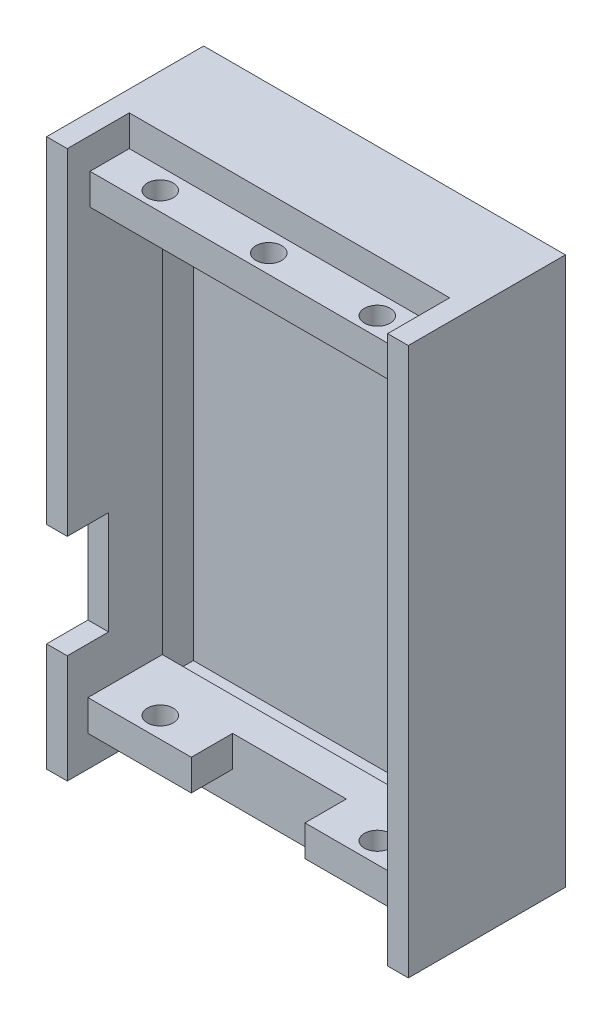
ISO-10303-21;
HEADER;
FILE_DESCRIPTION(('STEP AP214'),'2;1');
FILE_NAME('part.step','',(''),(''),'','','');
FILE_SCHEMA(('AUTOMOTIVE_DESIGN { 1 0 10303 214 1 1 1 1 }'));
ENDSEC;
DATA;
#1=APPLICATION_CONTEXT('core data for automotive mechanical design processes');
#2=APPLICATION_PROTOCOL_DEFINITION('international standard','automotive_design',2000,#1);
#3=PRODUCT_CONTEXT('',#1,'mechanical');
#4=PRODUCT('Part','Part','',(#3));
#5=PRODUCT_RELATED_PRODUCT_CATEGORY('part','',(#4));
#6=PRODUCT_DEFINITION_FORMATION('','',#4);
#7=PRODUCT_DEFINITION_CONTEXT('part definition',#1,'design');
#8=PRODUCT_DEFINITION('design','',#6,#7);
#9=PRODUCT_DEFINITION_SHAPE('','',#8);
#10=(LENGTH_UNIT() NAMED_UNIT(*) SI_UNIT(.MILLI.,.METRE.));
#11=(NAMED_UNIT(*) PLANE_ANGLE_UNIT() SI_UNIT($,.RADIAN.));
#12=(NAMED_UNIT(*) SI_UNIT($,.STERADIAN.) SOLID_ANGLE_UNIT());
#13=UNCERTAINTY_MEASURE_WITH_UNIT(LENGTH_MEASURE(1.E-05),#10,'distance_accuracy_value','');
#14=(GEOMETRIC_REPRESENTATION_CONTEXT(3) GLOBAL_UNCERTAINTY_ASSIGNED_CONTEXT((#13)) GLOBAL_UNIT_ASSIGNED_CONTEXT((#10,
#11,#12)) REPRESENTATION_CONTEXT('',''));
#15=CARTESIAN_POINT('',(0.,0.,0.));
#16=DIRECTION('',(0.,0.,1.));
#17=DIRECTION('',(1.,0.,0.));
#18=AXIS2_PLACEMENT_3D('',#15,#16,#17);
#19=CARTESIAN_POINT('',(0.,0.,15.2));
#20=DIRECTION('',(0.,0.,1.));
#21=DIRECTION('',(1.,0.,0.));
#22=AXIS2_PLACEMENT_3D('',#19,#20,#21);
#23=PLANE('',#22);
#24=DIRECTION('',(-1.,0.,0.));
#25=VECTOR('',#24,1.);
#26=CARTESIAN_POINT('',(-13.,-12.5,15.2));
#27=LINE('',#26,#25);
#28=CARTESIAN_POINT('',(-13.,-12.5,15.2));
#29=VERTEX_POINT('',#28);
#30=CARTESIAN_POINT('',(-15.,-12.5,15.2));
#31=VERTEX_POINT('',#30);
#32=EDGE_CURVE('E265',#29,#31,#27,.T.);
#33=ORIENTED_EDGE('',*,*,#32,.F.);
#34=DIRECTION('',(0.,1.,0.));
#35=VECTOR('',#34,1.);
#36=CARTESIAN_POINT('',(-13.,-33.,15.2));
#37=LINE('',#36,#35);
#38=CARTESIAN_POINT('',(-13.,20.,15.2));
#39=VERTEX_POINT('',#38);
#40=EDGE_CURVE('E413',#29,#39,#37,.T.);
#41=ORIENTED_EDGE('',*,*,#40,.T.);
#42=DIRECTION('',(-1.,0.,0.));
#43=VECTOR('',#42,1.);
#44=CARTESIAN_POINT('',(-13.,20.,15.2));
#45=LINE('',#44,#43);
#46=CARTESIAN_POINT('',(-15.,20.,15.2));
#47=VERTEX_POINT('',#46);
#48=EDGE_CURVE('E403',#39,#47,#45,.T.);
#49=ORIENTED_EDGE('',*,*,#48,.T.);
#50=DIRECTION('',(0.,-1.,0.));
#51=VECTOR('',#50,1.);
#52=CARTESIAN_POINT('',(-15.,20.,15.2));
#53=LINE('',#52,#51);
#54=EDGE_CURVE('E408',#47,#31,#53,.T.);
#55=ORIENTED_EDGE('',*,*,#54,.T.);
#56=EDGE_LOOP('',(#33,#41,#49,#55));
#57=FACE_BOUND('',#56,.T.);
#58=ADVANCED_FACE('F39',(#57),#23,.T.);
#59=CARTESIAN_POINT('',(-13.,-30.,46.3448230047949));
#60=DIRECTION('',(0.,1.,0.));
#61=DIRECTION('',(0.,0.,1.));
#62=AXIS2_PLACEMENT_3D('',#59,#60,#61);
#63=PLANE('',#62);
#64=CARTESIAN_POINT('',(-7.99999999999999,-30.,11.2));
#65=DIRECTION('',(0.,-1.,0.));
#66=DIRECTION('',(0.,0.,-1.));
#67=AXIS2_PLACEMENT_3D('',#64,#65,#66);
#68=CIRCLE('',#67,1.25);
#69=CARTESIAN_POINT('',(-7.99999999999999,-30.,9.95));
#70=VERTEX_POINT('',#69);
#71=EDGE_CURVE('E285',#70,#70,#68,.T.);
#72=ORIENTED_EDGE('',*,*,#71,.F.);
#73=EDGE_LOOP('',(#72));
#74=FACE_BOUND('',#73,.T.);
#75=DIRECTION('',(-1.,0.,0.));
#76=VECTOR('',#75,1.);
#77=CARTESIAN_POINT('',(-13.,-30.,9.2));
#78=LINE('',#77,#76);
#79=CARTESIAN_POINT('',(-2.99999999999999,-30.,9.2));
#80=VERTEX_POINT('',#79);
#81=CARTESIAN_POINT('',(-13.,-30.,9.2));
#82=VERTEX_POINT('',#81);
#83=EDGE_CURVE('E397',#80,#82,#78,.T.);
#84=ORIENTED_EDGE('',*,*,#83,.F.);
#85=DIRECTION('',(0.,0.,1.));
#86=VECTOR('',#85,1.);
#87=CARTESIAN_POINT('',(-2.99999999999999,-30.,-2.20175425099138));
#88=LINE('',#87,#86);
#89=CARTESIAN_POINT('',(-2.99999999999999,-30.,13.2));
#90=VERTEX_POINT('',#89);
#91=EDGE_CURVE('E303',#80,#90,#88,.T.);
#92=ORIENTED_EDGE('',*,*,#91,.T.);
#93=DIRECTION('',(1.,0.,0.));
#94=VECTOR('',#93,1.);
#95=CARTESIAN_POINT('',(-13.,-30.,13.2));
#96=LINE('',#95,#94);
#97=CARTESIAN_POINT('',(-13.,-30.,13.2));
#98=VERTEX_POINT('',#97);
#99=EDGE_CURVE('E326',#98,#90,#96,.T.);
#100=ORIENTED_EDGE('',*,*,#99,.F.);
#101=DIRECTION('',(0.,0.,-1.));
#102=VECTOR('',#101,1.);
#103=CARTESIAN_POINT('',(-13.,-30.,46.3448230047949));
#104=LINE('',#103,#102);
#105=EDGE_CURVE('E373',#98,#82,#104,.T.);
#106=ORIENTED_EDGE('',*,*,#105,.T.);
#107=EDGE_LOOP('',(#84,#92,#100,#106));
#108=FACE_BOUND('',#107,.T.);
#109=ADVANCED_FACE('F549',(#74,#108),#63,.F.);
#110=CARTESIAN_POINT('',(0.,0.,13.2));
#111=DIRECTION('',(0.,0.,1.));
#112=DIRECTION('',(1.,0.,0.));
#113=AXIS2_PLACEMENT_3D('',#110,#111,#112);
#114=PLANE('',#113);
#115=DIRECTION('',(0.,-1.,0.));
#116=VECTOR('',#115,1.);
#117=CARTESIAN_POINT('',(-3.,-27.,13.2));
#118=LINE('',#117,#116);
#119=CARTESIAN_POINT('',(-3.,-27.,13.2));
#120=VERTEX_POINT('',#119);
#121=EDGE_CURVE('E292',#120,#90,#118,.T.);
#122=ORIENTED_EDGE('',*,*,#121,.F.);
#123=DIRECTION('',(-1.,0.,0.));
#124=VECTOR('',#123,1.);
#125=CARTESIAN_POINT('',(18.,-27.,13.2));
#126=LINE('',#125,#124);
#127=CARTESIAN_POINT('',(-13.,-27.,13.2));
#128=VERTEX_POINT('',#127);
#129=EDGE_CURVE('E319',#120,#128,#126,.T.);
#130=ORIENTED_EDGE('',*,*,#129,.T.);
#131=DIRECTION('',(0.,-1.,0.));
#132=VECTOR('',#131,1.);
#133=CARTESIAN_POINT('',(-13.,-27.,13.2));
#134=LINE('',#133,#132);
#135=EDGE_CURVE('E323',#128,#98,#134,.T.);
#136=ORIENTED_EDGE('',*,*,#135,.T.);
#137=ORIENTED_EDGE('',*,*,#99,.T.);
#138=EDGE_LOOP('',(#122,#130,#136,#137));
#139=FACE_BOUND('',#138,.T.);
#140=ADVANCED_FACE('F546',(#139),#114,.T.);
#141=DIRECTION('',(0.,-1.,0.));
#142=VECTOR('',#141,1.);
#143=CARTESIAN_POINT('',(18.,-33.,15.2));
#144=LINE('',#143,#142);
#145=CARTESIAN_POINT('',(18.,20.,15.2));
#146=VERTEX_POINT('',#145);
#147=CARTESIAN_POINT('',(18.,-33.,15.2));
#148=VERTEX_POINT('',#147);
#149=EDGE_CURVE('E434',#146,#148,#144,.T.);
#150=ORIENTED_EDGE('',*,*,#149,.T.);
#151=DIRECTION('',(1.,0.,0.));
#152=VECTOR('',#151,1.);
#153=CARTESIAN_POINT('',(20.,-33.,15.2));
#154=LINE('',#153,#152);
#155=CARTESIAN_POINT('',(20.,-33.,15.2));
#156=VERTEX_POINT('',#155);
#157=EDGE_CURVE('E431',#148,#156,#154,.T.);
#158=ORIENTED_EDGE('',*,*,#157,.T.);
#159=DIRECTION('',(0.,1.,0.));
#160=VECTOR('',#159,1.);
#161=CARTESIAN_POINT('',(20.,20.,15.2));
#162=LINE('',#161,#160);
#163=CARTESIAN_POINT('',(20.,20.,15.2));
#164=VERTEX_POINT('',#163);
#165=EDGE_CURVE('E428',#156,#164,#162,.T.);
#166=ORIENTED_EDGE('',*,*,#165,.T.);
#167=DIRECTION('',(-1.,0.,0.));
#168=VECTOR('',#167,1.);
#169=CARTESIAN_POINT('',(18.,20.,15.2));
#170=LINE('',#169,#168);
#171=EDGE_CURVE('E407',#164,#146,#170,.T.);
#172=ORIENTED_EDGE('',*,*,#171,.T.);
#173=EDGE_LOOP('',(#150,#158,#166,#172));
#174=FACE_BOUND('',#173,.T.);
#175=ADVANCED_FACE('F478',(#174),#23,.T.);
#176=CARTESIAN_POINT('',(13.,-30.,11.2));
#177=DIRECTION('',(0.,-1.,0.));
#178=DIRECTION('',(0.,0.,-1.));
#179=AXIS2_PLACEMENT_3D('',#176,#177,#178);
#180=CIRCLE('',#179,1.25);
#181=CARTESIAN_POINT('',(13.,-30.,9.95));
#182=VERTEX_POINT('',#181);
#183=EDGE_CURVE('E278',#182,#182,#180,.T.);
#184=ORIENTED_EDGE('',*,*,#183,.F.);
#185=EDGE_LOOP('',(#184));
#186=FACE_BOUND('',#185,.T.);
#187=CARTESIAN_POINT('',(8.00000000000001,-30.,13.2));
#188=VERTEX_POINT('',#187);
#189=CARTESIAN_POINT('',(18.,-30.,13.2));
#190=VERTEX_POINT('',#189);
#191=EDGE_CURVE('E325',#188,#190,#96,.T.);
#192=ORIENTED_EDGE('',*,*,#191,.F.);
#193=DIRECTION('',(0.,0.,1.));
#194=VECTOR('',#193,1.);
#195=CARTESIAN_POINT('',(8.00000000000001,-30.,-2.20175425099138));
#196=LINE('',#195,#194);
#197=CARTESIAN_POINT('',(8.00000000000001,-30.,9.2));
#198=VERTEX_POINT('',#197);
#199=EDGE_CURVE('E312',#198,#188,#196,.T.);
#200=ORIENTED_EDGE('',*,*,#199,.F.);
#201=CARTESIAN_POINT('',(18.,-30.,9.2));
#202=VERTEX_POINT('',#201);
#203=EDGE_CURVE('E398',#202,#198,#78,.T.);
#204=ORIENTED_EDGE('',*,*,#203,.F.);
#205=DIRECTION('',(0.,0.,-1.));
#206=VECTOR('',#205,1.);
#207=CARTESIAN_POINT('',(18.,-30.,46.3448230047949));
#208=LINE('',#207,#206);
#209=EDGE_CURVE('E376',#190,#202,#208,.T.);
#210=ORIENTED_EDGE('',*,*,#209,.F.);
#211=EDGE_LOOP('',(#192,#200,#204,#210));
#212=FACE_BOUND('',#211,.T.);
#213=ADVANCED_FACE('F537',(#186,#212),#63,.F.);
#214=CARTESIAN_POINT('',(18.,-27.,46.3448230047949));
#215=DIRECTION('',(0.,-1.,0.));
#216=DIRECTION('',(1.,0.,0.));
#217=AXIS2_PLACEMENT_3D('',#214,#215,#216);
#218=PLANE('',#217);
#219=CARTESIAN_POINT('',(-7.99999999999999,-27.,11.2));
#220=DIRECTION('',(0.,-1.,0.));
#221=DIRECTION('',(1.,0.,0.));
#222=AXIS2_PLACEMENT_3D('',#219,#220,#221);
#223=CIRCLE('',#222,1.25);
#224=CARTESIAN_POINT('',(-6.74999999999999,-27.,11.2));
#225=VERTEX_POINT('',#224);
#226=EDGE_CURVE('E288',#225,#225,#223,.F.);
#227=ORIENTED_EDGE('',*,*,#226,.F.);
#228=EDGE_LOOP('',(#227));
#229=FACE_BOUND('',#228,.T.);
#230=CARTESIAN_POINT('',(13.,-27.,11.2));
#231=DIRECTION('',(0.,-1.,0.));
#232=DIRECTION('',(1.,0.,0.));
#233=AXIS2_PLACEMENT_3D('',#230,#231,#232);
#234=CIRCLE('',#233,1.25);
#235=CARTESIAN_POINT('',(14.25,-27.,11.2));
#236=VERTEX_POINT('',#235);
#237=EDGE_CURVE('E289',#236,#236,#234,.F.);
#238=ORIENTED_EDGE('',*,*,#237,.F.);
#239=EDGE_LOOP('',(#238));
#240=FACE_BOUND('',#239,.T.);
#241=DIRECTION('',(0.,0.,-1.));
#242=VECTOR('',#241,1.);
#243=CARTESIAN_POINT('',(18.,-27.,46.3448230047949));
#244=LINE('',#243,#242);
#245=CARTESIAN_POINT('',(18.,-27.,13.2));
#246=VERTEX_POINT('',#245);
#247=CARTESIAN_POINT('',(18.,-27.,6.));
#248=VERTEX_POINT('',#247);
#249=EDGE_CURVE('E344',#246,#248,#244,.T.);
#250=ORIENTED_EDGE('',*,*,#249,.T.);
#251=DIRECTION('',(-1.,0.,0.));
#252=VECTOR('',#251,1.);
#253=CARTESIAN_POINT('',(18.,-27.,6.));
#254=LINE('',#253,#252);
#255=CARTESIAN_POINT('',(-13.,-27.,6.));
#256=VERTEX_POINT('',#255);
#257=EDGE_CURVE('E249',#248,#256,#254,.T.);
#258=ORIENTED_EDGE('',*,*,#257,.T.);
#259=DIRECTION('',(0.,0.,-1.));
#260=VECTOR('',#259,1.);
#261=CARTESIAN_POINT('',(-13.,-27.,46.3448230047949));
#262=LINE('',#261,#260);
#263=EDGE_CURVE('E370',#128,#256,#262,.T.);
#264=ORIENTED_EDGE('',*,*,#263,.F.);
#265=ORIENTED_EDGE('',*,*,#129,.F.);
#266=DIRECTION('',(0.,0.,1.));
#267=VECTOR('',#266,1.);
#268=CARTESIAN_POINT('',(-3.,-27.,-2.20175425099138));
#269=LINE('',#268,#267);
#270=CARTESIAN_POINT('',(-3.,-27.,9.2));
#271=VERTEX_POINT('',#270);
#272=EDGE_CURVE('E307',#271,#120,#269,.T.);
#273=ORIENTED_EDGE('',*,*,#272,.F.);
#274=DIRECTION('',(-1.,0.,0.));
#275=VECTOR('',#274,1.);
#276=CARTESIAN_POINT('',(8.00000000000001,-27.,9.2));
#277=LINE('',#276,#275);
#278=CARTESIAN_POINT('',(8.00000000000001,-27.,9.2));
#279=VERTEX_POINT('',#278);
#280=EDGE_CURVE('E304',#279,#271,#277,.T.);
#281=ORIENTED_EDGE('',*,*,#280,.F.);
#282=DIRECTION('',(0.,0.,1.));
#283=VECTOR('',#282,1.);
#284=CARTESIAN_POINT('',(8.00000000000001,-27.,-2.20175425099138));
#285=LINE('',#284,#283);
#286=CARTESIAN_POINT('',(8.00000000000001,-27.,13.2));
#287=VERTEX_POINT('',#286);
#288=EDGE_CURVE('E308',#279,#287,#285,.T.);
#289=ORIENTED_EDGE('',*,*,#288,.T.);
#290=EDGE_CURVE('E320',#246,#287,#126,.T.);
#291=ORIENTED_EDGE('',*,*,#290,.F.);
#292=EDGE_LOOP('',(#250,#258,#264,#265,#273,#281,#289,#291));
#293=FACE_BOUND('',#292,.T.);
#294=ADVANCED_FACE('F527',(#229,#240,#293),#218,.F.);
#295=CARTESIAN_POINT('',(18.,17.,46.3448230047949));
#296=DIRECTION('',(0.,-1.,0.));
#297=DIRECTION('',(0.,0.,-1.));
#298=AXIS2_PLACEMENT_3D('',#295,#296,#297);
#299=PLANE('',#298);
#300=CARTESIAN_POINT('',(13.,17.,11.2));
#301=DIRECTION('',(0.,1.,0.));
#302=DIRECTION('',(0.,0.,1.));
#303=AXIS2_PLACEMENT_3D('',#300,#301,#302);
#304=CIRCLE('',#303,1.25);
#305=CARTESIAN_POINT('',(13.,17.,12.45));
#306=VERTEX_POINT('',#305);
#307=EDGE_CURVE('E354',#306,#306,#304,.T.);
#308=ORIENTED_EDGE('',*,*,#307,.F.);
#309=EDGE_LOOP('',(#308));
#310=FACE_BOUND('',#309,.T.);
#311=CARTESIAN_POINT('',(2.5,17.,11.2));
#312=DIRECTION('',(0.,1.,0.));
#313=DIRECTION('',(0.,0.,1.));
#314=AXIS2_PLACEMENT_3D('',#311,#312,#313);
#315=CIRCLE('',#314,1.25);
#316=CARTESIAN_POINT('',(2.5,17.,12.45));
#317=VERTEX_POINT('',#316);
#318=EDGE_CURVE('E348',#317,#317,#315,.T.);
#319=ORIENTED_EDGE('',*,*,#318,.F.);
#320=EDGE_LOOP('',(#319));
#321=FACE_BOUND('',#320,.T.);
#322=CARTESIAN_POINT('',(-8.,17.,11.2));
#323=DIRECTION('',(0.,1.,0.));
#324=DIRECTION('',(0.,0.,1.));
#325=AXIS2_PLACEMENT_3D('',#322,#323,#324);
#326=CIRCLE('',#325,1.25);
#327=CARTESIAN_POINT('',(-8.,17.,12.45));
#328=VERTEX_POINT('',#327);
#329=EDGE_CURVE('E345',#328,#328,#326,.T.);
#330=ORIENTED_EDGE('',*,*,#329,.F.);
#331=EDGE_LOOP('',(#330));
#332=FACE_BOUND('',#331,.T.);
#333=DIRECTION('',(-1.,0.,0.));
#334=VECTOR('',#333,1.);
#335=CARTESIAN_POINT('',(18.,17.,13.));
#336=LINE('',#335,#334);
#337=CARTESIAN_POINT('',(18.,17.,13.));
#338=VERTEX_POINT('',#337);
#339=CARTESIAN_POINT('',(-13.,17.,13.));
#340=VERTEX_POINT('',#339);
#341=EDGE_CURVE('E331',#338,#340,#336,.T.);
#342=ORIENTED_EDGE('',*,*,#341,.F.);
#343=DIRECTION('',(0.,0.,-1.));
#344=VECTOR('',#343,1.);
#345=CARTESIAN_POINT('',(18.,17.,46.3448230047949));
#346=LINE('',#345,#344);
#347=CARTESIAN_POINT('',(18.,17.,9.2));
#348=VERTEX_POINT('',#347);
#349=EDGE_CURVE('E362',#338,#348,#346,.T.);
#350=ORIENTED_EDGE('',*,*,#349,.T.);
#351=DIRECTION('',(1.,0.,0.));
#352=VECTOR('',#351,1.);
#353=CARTESIAN_POINT('',(-13.,17.,9.2));
#354=LINE('',#353,#352);
#355=CARTESIAN_POINT('',(-13.,17.,9.2));
#356=VERTEX_POINT('',#355);
#357=EDGE_CURVE('E386',#356,#348,#354,.T.);
#358=ORIENTED_EDGE('',*,*,#357,.F.);
#359=DIRECTION('',(0.,0.,-1.));
#360=VECTOR('',#359,1.);
#361=CARTESIAN_POINT('',(-13.,17.,46.3448230047949));
#362=LINE('',#361,#360);
#363=EDGE_CURVE('E359',#340,#356,#362,.T.);
#364=ORIENTED_EDGE('',*,*,#363,.F.);
#365=EDGE_LOOP('',(#342,#350,#358,#364));
#366=FACE_BOUND('',#365,.T.);
#367=ADVANCED_FACE('F517',(#310,#321,#332,#366),#299,.F.);
#368=CARTESIAN_POINT('',(-13.,14.,46.3448230047949));
#369=DIRECTION('',(0.,1.,0.));
#370=DIRECTION('',(0.,0.,1.));
#371=AXIS2_PLACEMENT_3D('',#368,#369,#370);
#372=PLANE('',#371);
#373=CARTESIAN_POINT('',(13.,14.,11.2));
#374=DIRECTION('',(0.,1.,0.));
#375=DIRECTION('',(0.,0.,1.));
#376=AXIS2_PLACEMENT_3D('',#373,#374,#375);
#377=CIRCLE('',#376,1.25);
#378=CARTESIAN_POINT('',(13.,14.,12.45));
#379=VERTEX_POINT('',#378);
#380=EDGE_CURVE('E340',#379,#379,#377,.F.);
#381=ORIENTED_EDGE('',*,*,#380,.F.);
#382=EDGE_LOOP('',(#381));
#383=FACE_BOUND('',#382,.T.);
#384=CARTESIAN_POINT('',(2.5,14.,11.2));
#385=DIRECTION('',(0.,1.,0.));
#386=DIRECTION('',(0.,0.,1.));
#387=AXIS2_PLACEMENT_3D('',#384,#385,#386);
#388=CIRCLE('',#387,1.25);
#389=CARTESIAN_POINT('',(2.5,14.,12.45));
#390=VERTEX_POINT('',#389);
#391=EDGE_CURVE('E351',#390,#390,#388,.F.);
#392=ORIENTED_EDGE('',*,*,#391,.F.);
#393=EDGE_LOOP('',(#392));
#394=FACE_BOUND('',#393,.T.);
#395=CARTESIAN_POINT('',(-8.,14.,11.2));
#396=DIRECTION('',(0.,1.,0.));
#397=DIRECTION('',(0.,0.,1.));
#398=AXIS2_PLACEMENT_3D('',#395,#396,#397);
#399=CIRCLE('',#398,1.25);
#400=CARTESIAN_POINT('',(-8.,14.,12.45));
#401=VERTEX_POINT('',#400);
#402=EDGE_CURVE('E341',#401,#401,#399,.F.);
#403=ORIENTED_EDGE('',*,*,#402,.F.);
#404=EDGE_LOOP('',(#403));
#405=FACE_BOUND('',#404,.T.);
#406=DIRECTION('',(0.,0.,-1.));
#407=VECTOR('',#406,1.);
#408=CARTESIAN_POINT('',(-13.,14.,46.3448230047949));
#409=LINE('',#408,#407);
#410=CARTESIAN_POINT('',(-13.,14.,13.));
#411=VERTEX_POINT('',#410);
#412=CARTESIAN_POINT('',(-13.,14.,6.));
#413=VERTEX_POINT('',#412);
#414=EDGE_CURVE('E361',#411,#413,#409,.T.);
#415=ORIENTED_EDGE('',*,*,#414,.T.);
#416=DIRECTION('',(1.,0.,0.));
#417=VECTOR('',#416,1.);
#418=CARTESIAN_POINT('',(-13.,14.,6.));
#419=LINE('',#418,#417);
#420=CARTESIAN_POINT('',(18.,14.,6.));
#421=VERTEX_POINT('',#420);
#422=EDGE_CURVE('E54',#413,#421,#419,.T.);
#423=ORIENTED_EDGE('',*,*,#422,.T.);
#424=DIRECTION('',(0.,0.,-1.));
#425=VECTOR('',#424,1.);
#426=CARTESIAN_POINT('',(18.,14.,46.3448230047949));
#427=LINE('',#426,#425);
#428=CARTESIAN_POINT('',(18.,14.,13.));
#429=VERTEX_POINT('',#428);
#430=EDGE_CURVE('E365',#429,#421,#427,.T.);
#431=ORIENTED_EDGE('',*,*,#430,.F.);
#432=DIRECTION('',(1.,0.,0.));
#433=VECTOR('',#432,1.);
#434=CARTESIAN_POINT('',(-13.,14.,13.));
#435=LINE('',#434,#433);
#436=EDGE_CURVE('E336',#411,#429,#435,.T.);
#437=ORIENTED_EDGE('',*,*,#436,.F.);
#438=EDGE_LOOP('',(#415,#423,#431,#437));
#439=FACE_BOUND('',#438,.T.);
#440=ADVANCED_FACE('F523',(#383,#394,#405,#439),#372,.F.);
#441=CARTESIAN_POINT('',(18.,-33.,15.2));
#442=DIRECTION('',(1.,0.,0.));
#443=DIRECTION('',(0.,0.,-1.));
#444=AXIS2_PLACEMENT_3D('',#441,#442,#443);
#445=PLANE('',#444);
#446=ORIENTED_EDGE('',*,*,#430,.T.);
#447=DIRECTION('',(0.,-1.,0.));
#448=VECTOR('',#447,1.);
#449=CARTESIAN_POINT('',(18.,-33.,6.));
#450=LINE('',#449,#448);
#451=EDGE_CURVE('E257',#421,#248,#450,.T.);
#452=ORIENTED_EDGE('',*,*,#451,.T.);
#453=ORIENTED_EDGE('',*,*,#249,.F.);
#454=DIRECTION('',(0.,1.,0.));
#455=VECTOR('',#454,1.);
#456=CARTESIAN_POINT('',(18.,-30.,13.2));
#457=LINE('',#456,#455);
#458=EDGE_CURVE('E329',#190,#246,#457,.T.);
#459=ORIENTED_EDGE('',*,*,#458,.F.);
#460=ORIENTED_EDGE('',*,*,#209,.T.);
#461=DIRECTION('',(0.,1.,0.));
#462=VECTOR('',#461,1.);
#463=CARTESIAN_POINT('',(18.,-30.,9.2));
#464=LINE('',#463,#462);
#465=CARTESIAN_POINT('',(18.,-33.,9.2));
#466=VERTEX_POINT('',#465);
#467=EDGE_CURVE('E383',#466,#202,#464,.T.);
#468=ORIENTED_EDGE('',*,*,#467,.F.);
#469=DIRECTION('',(0.,0.,-1.));
#470=VECTOR('',#469,1.);
#471=CARTESIAN_POINT('',(18.,-33.,15.2));
#472=LINE('',#471,#470);
#473=EDGE_CURVE('E425',#148,#466,#472,.T.);
#474=ORIENTED_EDGE('',*,*,#473,.F.);
#475=ORIENTED_EDGE('',*,*,#149,.F.);
#476=DIRECTION('',(0.,0.,-1.));
#477=VECTOR('',#476,1.);
#478=CARTESIAN_POINT('',(18.,20.,15.2));
#479=LINE('',#478,#477);
#480=CARTESIAN_POINT('',(18.,20.,9.2));
#481=VERTEX_POINT('',#480);
#482=EDGE_CURVE('E391',#146,#481,#479,.T.);
#483=ORIENTED_EDGE('',*,*,#482,.T.);
#484=DIRECTION('',(0.,1.,0.));
#485=VECTOR('',#484,1.);
#486=CARTESIAN_POINT('',(18.,17.,9.2));
#487=LINE('',#486,#485);
#488=EDGE_CURVE('E389',#348,#481,#487,.T.);
#489=ORIENTED_EDGE('',*,*,#488,.F.);
#490=ORIENTED_EDGE('',*,*,#349,.F.);
#491=DIRECTION('',(0.,1.,0.));
#492=VECTOR('',#491,1.);
#493=CARTESIAN_POINT('',(18.,14.,13.));
#494=LINE('',#493,#492);
#495=EDGE_CURVE('E338',#429,#338,#494,.T.);
#496=ORIENTED_EDGE('',*,*,#495,.F.);
#497=EDGE_LOOP('',(#446,#452,#453,#459,#460,#468,#474,#475,#483,#489,#490,#496));
#498=FACE_BOUND('',#497,.T.);
#499=ADVANCED_FACE('F509',(#498),#445,.F.);
#500=CARTESIAN_POINT('',(-13.,-33.,15.2));
#501=DIRECTION('',(-1.,0.,0.));
#502=DIRECTION('',(0.,-1.,0.));
#503=AXIS2_PLACEMENT_3D('',#500,#501,#502);
#504=PLANE('',#503);
#505=ORIENTED_EDGE('',*,*,#263,.T.);
#506=DIRECTION('',(0.,1.,0.));
#507=VECTOR('',#506,1.);
#508=CARTESIAN_POINT('',(-13.,-33.,6.));
#509=LINE('',#508,#507);
#510=EDGE_CURVE('E11',#256,#413,#509,.T.);
#511=ORIENTED_EDGE('',*,*,#510,.T.);
#512=ORIENTED_EDGE('',*,*,#414,.F.);
#513=DIRECTION('',(0.,-1.,0.));
#514=VECTOR('',#513,1.);
#515=CARTESIAN_POINT('',(-13.,17.,13.));
#516=LINE('',#515,#514);
#517=EDGE_CURVE('E334',#340,#411,#516,.T.);
#518=ORIENTED_EDGE('',*,*,#517,.F.);
#519=ORIENTED_EDGE('',*,*,#363,.T.);
#520=DIRECTION('',(0.,-1.,0.));
#521=VECTOR('',#520,1.);
#522=CARTESIAN_POINT('',(-13.,20.,9.2));
#523=LINE('',#522,#521);
#524=CARTESIAN_POINT('',(-13.,20.,9.2));
#525=VERTEX_POINT('',#524);
#526=EDGE_CURVE('E382',#525,#356,#523,.T.);
#527=ORIENTED_EDGE('',*,*,#526,.F.);
#528=DIRECTION('',(0.,0.,-1.));
#529=VECTOR('',#528,1.);
#530=CARTESIAN_POINT('',(-13.,20.,15.2));
#531=LINE('',#530,#529);
#532=EDGE_CURVE('E417',#39,#525,#531,.T.);
#533=ORIENTED_EDGE('',*,*,#532,.F.);
#534=ORIENTED_EDGE('',*,*,#40,.F.);
#535=DIRECTION('',(0.,0.,1.));
#536=VECTOR('',#535,1.);
#537=CARTESIAN_POINT('',(-13.,-12.5,11.2));
#538=LINE('',#537,#536);
#539=CARTESIAN_POINT('',(-13.,-12.5,11.2));
#540=VERTEX_POINT('',#539);
#541=EDGE_CURVE('E279',#540,#29,#538,.T.);
#542=ORIENTED_EDGE('',*,*,#541,.F.);
#543=DIRECTION('',(0.,1.,0.));
#544=VECTOR('',#543,1.);
#545=CARTESIAN_POINT('',(-13.,-22.5,11.2));
#546=LINE('',#545,#544);
#547=CARTESIAN_POINT('',(-13.,-22.5,11.2));
#548=VERTEX_POINT('',#547);
#549=EDGE_CURVE('E268',#548,#540,#546,.T.);
#550=ORIENTED_EDGE('',*,*,#549,.F.);
#551=DIRECTION('',(0.,0.,1.));
#552=VECTOR('',#551,1.);
#553=CARTESIAN_POINT('',(-13.,-22.5,11.2));
#554=LINE('',#553,#552);
#555=CARTESIAN_POINT('',(-13.,-22.5,15.2));
#556=VERTEX_POINT('',#555);
#557=EDGE_CURVE('E281',#548,#556,#554,.T.);
#558=ORIENTED_EDGE('',*,*,#557,.T.);
#559=CARTESIAN_POINT('',(-13.,-33.,15.2));
#560=VERTEX_POINT('',#559);
#561=EDGE_CURVE('E414',#560,#556,#37,.T.);
#562=ORIENTED_EDGE('',*,*,#561,.F.);
#563=DIRECTION('',(0.,0.,-1.));
#564=VECTOR('',#563,1.);
#565=CARTESIAN_POINT('',(-13.,-33.,15.2));
#566=LINE('',#565,#564);
#567=CARTESIAN_POINT('',(-13.,-33.,9.2));
#568=VERTEX_POINT('',#567);
#569=EDGE_CURVE('E420',#560,#568,#566,.T.);
#570=ORIENTED_EDGE('',*,*,#569,.T.);
#571=DIRECTION('',(0.,-1.,0.));
#572=VECTOR('',#571,1.);
#573=CARTESIAN_POINT('',(-13.,-33.,9.2));
#574=LINE('',#573,#572);
#575=EDGE_CURVE('E394',#82,#568,#574,.T.);
#576=ORIENTED_EDGE('',*,*,#575,.F.);
#577=ORIENTED_EDGE('',*,*,#105,.F.);
#578=ORIENTED_EDGE('',*,*,#135,.F.);
#579=EDGE_LOOP('',(#505,#511,#512,#518,#519,#527,#533,#534,#542,#550,#558,#562,#570,#576,#577,#578));
#580=FACE_BOUND('',#579,.T.);
#581=ADVANCED_FACE('F489',(#580),#504,.F.);
#582=CARTESIAN_POINT('',(-15.,20.,2.));
#583=DIRECTION('',(1.,0.,0.));
#584=DIRECTION('',(0.,1.,0.));
#585=AXIS2_PLACEMENT_3D('',#582,#583,#584);
#586=PLANE('',#585);
#587=DIRECTION('',(0.,-1.,0.));
#588=VECTOR('',#587,1.);
#589=CARTESIAN_POINT('',(-15.,-12.5,11.2));
#590=LINE('',#589,#588);
#591=CARTESIAN_POINT('',(-15.,-12.5,11.2));
#592=VERTEX_POINT('',#591);
#593=CARTESIAN_POINT('',(-15.,-22.5,11.2));
#594=VERTEX_POINT('',#593);
#595=EDGE_CURVE('E261',#592,#594,#590,.T.);
#596=ORIENTED_EDGE('',*,*,#595,.F.);
#597=DIRECTION('',(0.,0.,1.));
#598=VECTOR('',#597,1.);
#599=CARTESIAN_POINT('',(-15.,-12.5,11.2));
#600=LINE('',#599,#598);
#601=EDGE_CURVE('E275',#592,#31,#600,.T.);
#602=ORIENTED_EDGE('',*,*,#601,.T.);
#603=ORIENTED_EDGE('',*,*,#54,.F.);
#604=DIRECTION('',(0.,0.,-1.));
#605=VECTOR('',#604,1.);
#606=CARTESIAN_POINT('',(-15.,20.,2.));
#607=LINE('',#606,#605);
#608=CARTESIAN_POINT('',(-15.,20.,0.));
#609=VERTEX_POINT('',#608);
#610=EDGE_CURVE('E446',#47,#609,#607,.T.);
#611=ORIENTED_EDGE('',*,*,#610,.T.);
#612=DIRECTION('',(0.,-1.,0.));
#613=VECTOR('',#612,1.);
#614=CARTESIAN_POINT('',(-15.,20.,0.));
#615=LINE('',#614,#613);
#616=CARTESIAN_POINT('',(-15.,-33.,0.));
#617=VERTEX_POINT('',#616);
#618=EDGE_CURVE('E422',#609,#617,#615,.T.);
#619=ORIENTED_EDGE('',*,*,#618,.T.);
#620=DIRECTION('',(0.,0.,-1.));
#621=VECTOR('',#620,1.);
#622=CARTESIAN_POINT('',(-15.,-33.,2.));
#623=LINE('',#622,#621);
#624=CARTESIAN_POINT('',(-15.,-33.,15.2));
#625=VERTEX_POINT('',#624);
#626=EDGE_CURVE('E47',#625,#617,#623,.T.);
#627=ORIENTED_EDGE('',*,*,#626,.F.);
#628=CARTESIAN_POINT('',(-15.,-22.5,15.2));
#629=VERTEX_POINT('',#628);
#630=EDGE_CURVE('E406',#629,#625,#53,.T.);
#631=ORIENTED_EDGE('',*,*,#630,.F.);
#632=DIRECTION('',(0.,0.,1.));
#633=VECTOR('',#632,1.);
#634=CARTESIAN_POINT('',(-15.,-22.5,11.2));
#635=LINE('',#634,#633);
#636=EDGE_CURVE('E61',#594,#629,#635,.T.);
#637=ORIENTED_EDGE('',*,*,#636,.F.);
#638=EDGE_LOOP('',(#596,#602,#603,#611,#619,#627,#631,#637));
#639=FACE_BOUND('',#638,.T.);
#640=ADVANCED_FACE('F41',(#639),#586,.F.);
#641=CARTESIAN_POINT('',(-15.,-33.,2.));
#642=DIRECTION('',(0.,1.,0.));
#643=DIRECTION('',(0.,0.,1.));
#644=AXIS2_PLACEMENT_3D('',#641,#642,#643);
#645=PLANE('',#644);
#646=DIRECTION('',(1.,0.,0.));
#647=VECTOR('',#646,1.);
#648=CARTESIAN_POINT('',(-15.,-33.,0.));
#649=LINE('',#648,#647);
#650=CARTESIAN_POINT('',(20.,-33.,0.));
#651=VERTEX_POINT('',#650);
#652=EDGE_CURVE('E440',#617,#651,#649,.T.);
#653=ORIENTED_EDGE('',*,*,#652,.T.);
#654=DIRECTION('',(0.,0.,-1.));
#655=VECTOR('',#654,1.);
#656=CARTESIAN_POINT('',(20.,-33.,2.));
#657=LINE('',#656,#655);
#658=EDGE_CURVE('E452',#156,#651,#657,.T.);
#659=ORIENTED_EDGE('',*,*,#658,.F.);
#660=ORIENTED_EDGE('',*,*,#157,.F.);
#661=ORIENTED_EDGE('',*,*,#473,.T.);
#662=DIRECTION('',(1.,0.,0.));
#663=VECTOR('',#662,1.);
#664=CARTESIAN_POINT('',(18.,-33.,9.2));
#665=LINE('',#664,#663);
#666=EDGE_CURVE('E368',#568,#466,#665,.T.);
#667=ORIENTED_EDGE('',*,*,#666,.F.);
#668=ORIENTED_EDGE('',*,*,#569,.F.);
#669=DIRECTION('',(1.,0.,0.));
#670=VECTOR('',#669,1.);
#671=CARTESIAN_POINT('',(-15.,-33.,15.2));
#672=LINE('',#671,#670);
#673=EDGE_CURVE('E411',#625,#560,#672,.T.);
#674=ORIENTED_EDGE('',*,*,#673,.F.);
#675=ORIENTED_EDGE('',*,*,#626,.T.);
#676=EDGE_LOOP('',(#653,#659,#660,#661,#667,#668,#674,#675));
#677=FACE_BOUND('',#676,.T.);
#678=ADVANCED_FACE('F458',(#677),#645,.F.);
#679=CARTESIAN_POINT('',(20.,20.,2.));
#680=DIRECTION('',(-1.,0.,0.));
#681=DIRECTION('',(0.,-1.,0.));
#682=AXIS2_PLACEMENT_3D('',#679,#680,#681);
#683=PLANE('',#682);
#684=DIRECTION('',(0.,1.,0.));
#685=VECTOR('',#684,1.);
#686=CARTESIAN_POINT('',(20.,20.,0.));
#687=LINE('',#686,#685);
#688=CARTESIAN_POINT('',(20.,20.,0.));
#689=VERTEX_POINT('',#688);
#690=EDGE_CURVE('E442',#651,#689,#687,.T.);
#691=ORIENTED_EDGE('',*,*,#690,.T.);
#692=DIRECTION('',(0.,0.,-1.));
#693=VECTOR('',#692,1.);
#694=CARTESIAN_POINT('',(20.,20.,2.));
#695=LINE('',#694,#693);
#696=EDGE_CURVE('E449',#164,#689,#695,.T.);
#697=ORIENTED_EDGE('',*,*,#696,.F.);
#698=ORIENTED_EDGE('',*,*,#165,.F.);
#699=ORIENTED_EDGE('',*,*,#658,.T.);
#700=EDGE_LOOP('',(#691,#697,#698,#699));
#701=FACE_BOUND('',#700,.T.);
#702=ADVANCED_FACE('F470',(#701),#683,.F.);
#703=CARTESIAN_POINT('',(-15.,20.,2.));
#704=DIRECTION('',(0.,-1.,0.));
#705=DIRECTION('',(1.,0.,0.));
#706=AXIS2_PLACEMENT_3D('',#703,#704,#705);
#707=PLANE('',#706);
#708=DIRECTION('',(-1.,0.,0.));
#709=VECTOR('',#708,1.);
#710=CARTESIAN_POINT('',(-15.,20.,0.));
#711=LINE('',#710,#709);
#712=EDGE_CURVE('E444',#689,#609,#711,.T.);
#713=ORIENTED_EDGE('',*,*,#712,.T.);
#714=ORIENTED_EDGE('',*,*,#610,.F.);
#715=ORIENTED_EDGE('',*,*,#48,.F.);
#716=ORIENTED_EDGE('',*,*,#532,.T.);
#717=DIRECTION('',(-1.,0.,0.));
#718=VECTOR('',#717,1.);
#719=CARTESIAN_POINT('',(18.,20.,9.2));
#720=LINE('',#719,#718);
#721=EDGE_CURVE('E380',#481,#525,#720,.T.);
#722=ORIENTED_EDGE('',*,*,#721,.F.);
#723=ORIENTED_EDGE('',*,*,#482,.F.);
#724=ORIENTED_EDGE('',*,*,#171,.F.);
#725=ORIENTED_EDGE('',*,*,#696,.T.);
#726=EDGE_LOOP('',(#713,#714,#715,#716,#722,#723,#724,#725));
#727=FACE_BOUND('',#726,.T.);
#728=ADVANCED_FACE('F474',(#727),#707,.F.);
#729=CARTESIAN_POINT('',(0.,0.,0.));
#730=DIRECTION('',(0.,0.,1.));
#731=DIRECTION('',(1.,0.,0.));
#732=AXIS2_PLACEMENT_3D('',#729,#730,#731);
#733=PLANE('',#732);
#734=ORIENTED_EDGE('',*,*,#618,.F.);
#735=ORIENTED_EDGE('',*,*,#712,.F.);
#736=ORIENTED_EDGE('',*,*,#690,.F.);
#737=ORIENTED_EDGE('',*,*,#652,.F.);
#738=EDGE_LOOP('',(#734,#735,#736,#737));
#739=FACE_BOUND('',#738,.T.);
#740=ADVANCED_FACE('F467',(#739),#733,.F.);
#741=DIRECTION('',(1.,0.,0.));
#742=VECTOR('',#741,1.);
#743=CARTESIAN_POINT('',(-15.,-22.5,15.2));
#744=LINE('',#743,#742);
#745=EDGE_CURVE('E260',#629,#556,#744,.T.);
#746=ORIENTED_EDGE('',*,*,#745,.F.);
#747=ORIENTED_EDGE('',*,*,#630,.T.);
#748=ORIENTED_EDGE('',*,*,#673,.T.);
#749=ORIENTED_EDGE('',*,*,#561,.T.);
#750=EDGE_LOOP('',(#746,#747,#748,#749));
#751=FACE_BOUND('',#750,.T.);
#752=ADVANCED_FACE('F494',(#751),#23,.T.);
#753=CARTESIAN_POINT('',(0.,0.,9.2));
#754=DIRECTION('',(0.,0.,-1.));
#755=DIRECTION('',(-1.,0.,0.));
#756=AXIS2_PLACEMENT_3D('',#753,#754,#755);
#757=PLANE('',#756);
#758=ORIENTED_EDGE('',*,*,#467,.T.);
#759=ORIENTED_EDGE('',*,*,#203,.T.);
#760=DIRECTION('',(0.,1.,0.));
#761=VECTOR('',#760,1.);
#762=CARTESIAN_POINT('',(8.00000000000001,-30.,9.2));
#763=LINE('',#762,#761);
#764=EDGE_CURVE('E309',#198,#279,#763,.T.);
#765=ORIENTED_EDGE('',*,*,#764,.T.);
#766=ORIENTED_EDGE('',*,*,#280,.T.);
#767=DIRECTION('',(0.,-1.,0.));
#768=VECTOR('',#767,1.);
#769=CARTESIAN_POINT('',(-3.,-27.,9.2));
#770=LINE('',#769,#768);
#771=EDGE_CURVE('E299',#271,#80,#770,.T.);
#772=ORIENTED_EDGE('',*,*,#771,.T.);
#773=ORIENTED_EDGE('',*,*,#83,.T.);
#774=ORIENTED_EDGE('',*,*,#575,.T.);
#775=ORIENTED_EDGE('',*,*,#666,.T.);
#776=EDGE_LOOP('',(#758,#759,#765,#766,#772,#773,#774,#775));
#777=FACE_BOUND('',#776,.T.);
#778=ADVANCED_FACE('F484',(#777),#757,.F.);
#779=CARTESIAN_POINT('',(0.,0.,9.2));
#780=DIRECTION('',(0.,0.,1.));
#781=DIRECTION('',(1.,0.,0.));
#782=AXIS2_PLACEMENT_3D('',#779,#780,#781);
#783=PLANE('',#782);
#784=ORIENTED_EDGE('',*,*,#721,.T.);
#785=ORIENTED_EDGE('',*,*,#526,.T.);
#786=ORIENTED_EDGE('',*,*,#357,.T.);
#787=ORIENTED_EDGE('',*,*,#488,.T.);
#788=EDGE_LOOP('',(#784,#785,#786,#787));
#789=FACE_BOUND('',#788,.T.);
#790=ADVANCED_FACE('F512',(#789),#783,.T.);
#791=CARTESIAN_POINT('',(13.,-33.001,11.2));
#792=DIRECTION('',(0.,1.,0.));
#793=DIRECTION('',(0.,0.,1.));
#794=AXIS2_PLACEMENT_3D('',#791,#792,#793);
#795=CYLINDRICAL_SURFACE('',#794,1.25);
#796=ORIENTED_EDGE('',*,*,#307,.T.);
#797=EDGE_LOOP('',(#796));
#798=FACE_BOUND('',#797,.T.);
#799=ORIENTED_EDGE('',*,*,#380,.T.);
#800=EDGE_LOOP('',(#799));
#801=FACE_BOUND('',#800,.T.);
#802=ADVANCED_FACE('F599',(#798,#801),#795,.F.);
#803=CARTESIAN_POINT('',(2.5,-33.001,11.2));
#804=DIRECTION('',(0.,1.,0.));
#805=DIRECTION('',(0.,0.,1.));
#806=AXIS2_PLACEMENT_3D('',#803,#804,#805);
#807=CYLINDRICAL_SURFACE('',#806,1.25);
#808=ORIENTED_EDGE('',*,*,#318,.T.);
#809=EDGE_LOOP('',(#808));
#810=FACE_BOUND('',#809,.T.);
#811=ORIENTED_EDGE('',*,*,#391,.T.);
#812=EDGE_LOOP('',(#811));
#813=FACE_BOUND('',#812,.T.);
#814=ADVANCED_FACE('F595',(#810,#813),#807,.F.);
#815=CARTESIAN_POINT('',(-8.,-33.001,11.2));
#816=DIRECTION('',(0.,1.,0.));
#817=DIRECTION('',(0.,0.,1.));
#818=AXIS2_PLACEMENT_3D('',#815,#816,#817);
#819=CYLINDRICAL_SURFACE('',#818,1.25);
#820=ORIENTED_EDGE('',*,*,#329,.T.);
#821=EDGE_LOOP('',(#820));
#822=FACE_BOUND('',#821,.T.);
#823=ORIENTED_EDGE('',*,*,#402,.T.);
#824=EDGE_LOOP('',(#823));
#825=FACE_BOUND('',#824,.T.);
#826=ADVANCED_FACE('F592',(#822,#825),#819,.F.);
#827=CARTESIAN_POINT('',(0.,0.,13.));
#828=DIRECTION('',(0.,0.,1.));
#829=DIRECTION('',(1.,0.,0.));
#830=AXIS2_PLACEMENT_3D('',#827,#828,#829);
#831=PLANE('',#830);
#832=ORIENTED_EDGE('',*,*,#341,.T.);
#833=ORIENTED_EDGE('',*,*,#517,.T.);
#834=ORIENTED_EDGE('',*,*,#436,.T.);
#835=ORIENTED_EDGE('',*,*,#495,.T.);
#836=EDGE_LOOP('',(#832,#833,#834,#835));
#837=FACE_BOUND('',#836,.T.);
#838=ADVANCED_FACE('F519',(#837),#831,.T.);
#839=DIRECTION('',(0.,1.,0.));
#840=VECTOR('',#839,1.);
#841=CARTESIAN_POINT('',(8.00000000000001,-30.,13.2));
#842=LINE('',#841,#840);
#843=EDGE_CURVE('E297',#188,#287,#842,.T.);
#844=ORIENTED_EDGE('',*,*,#843,.F.);
#845=ORIENTED_EDGE('',*,*,#191,.T.);
#846=ORIENTED_EDGE('',*,*,#458,.T.);
#847=ORIENTED_EDGE('',*,*,#290,.T.);
#848=EDGE_LOOP('',(#844,#845,#846,#847));
#849=FACE_BOUND('',#848,.T.);
#850=ADVANCED_FACE('F559',(#849),#114,.T.);
#851=CARTESIAN_POINT('',(-3.,-27.,-2.20175425099138));
#852=DIRECTION('',(-1.,0.,0.));
#853=DIRECTION('',(0.,-1.,0.));
#854=AXIS2_PLACEMENT_3D('',#851,#852,#853);
#855=PLANE('',#854);
#856=ORIENTED_EDGE('',*,*,#272,.T.);
#857=ORIENTED_EDGE('',*,*,#121,.T.);
#858=ORIENTED_EDGE('',*,*,#91,.F.);
#859=ORIENTED_EDGE('',*,*,#771,.F.);
#860=EDGE_LOOP('',(#856,#857,#858,#859));
#861=FACE_BOUND('',#860,.T.);
#862=ADVANCED_FACE('F544',(#861),#855,.F.);
#863=CARTESIAN_POINT('',(8.00000000000001,-30.,-2.20175425099138));
#864=DIRECTION('',(1.,0.,0.));
#865=DIRECTION('',(0.,0.,-1.));
#866=AXIS2_PLACEMENT_3D('',#863,#864,#865);
#867=PLANE('',#866);
#868=ORIENTED_EDGE('',*,*,#199,.T.);
#869=ORIENTED_EDGE('',*,*,#843,.T.);
#870=ORIENTED_EDGE('',*,*,#288,.F.);
#871=ORIENTED_EDGE('',*,*,#764,.F.);
#872=EDGE_LOOP('',(#868,#869,#870,#871));
#873=FACE_BOUND('',#872,.T.);
#874=ADVANCED_FACE('F576',(#873),#867,.F.);
#875=CARTESIAN_POINT('',(13.,-23.4644660940673,11.2));
#876=DIRECTION('',(0.,-1.,0.));
#877=DIRECTION('',(0.,0.,-1.));
#878=AXIS2_PLACEMENT_3D('',#875,#876,#877);
#879=CYLINDRICAL_SURFACE('',#878,1.25);
#880=ORIENTED_EDGE('',*,*,#237,.T.);
#881=EDGE_LOOP('',(#880));
#882=FACE_BOUND('',#881,.T.);
#883=ORIENTED_EDGE('',*,*,#183,.T.);
#884=EDGE_LOOP('',(#883));
#885=FACE_BOUND('',#884,.T.);
#886=ADVANCED_FACE('F574',(#882,#885),#879,.F.);
#887=CARTESIAN_POINT('',(-7.99999999999999,-23.4644660940673,11.2));
#888=DIRECTION('',(0.,-1.,0.));
#889=DIRECTION('',(0.,0.,-1.));
#890=AXIS2_PLACEMENT_3D('',#887,#888,#889);
#891=CYLINDRICAL_SURFACE('',#890,1.25);
#892=ORIENTED_EDGE('',*,*,#226,.T.);
#893=EDGE_LOOP('',(#892));
#894=FACE_BOUND('',#893,.T.);
#895=ORIENTED_EDGE('',*,*,#71,.T.);
#896=EDGE_LOOP('',(#895));
#897=FACE_BOUND('',#896,.T.);
#898=ADVANCED_FACE('F575',(#894,#897),#891,.F.);
#899=CARTESIAN_POINT('',(-13.,-12.5,11.2));
#900=DIRECTION('',(0.,1.,0.));
#901=DIRECTION('',(-1.,0.,0.));
#902=AXIS2_PLACEMENT_3D('',#899,#900,#901);
#903=PLANE('',#902);
#904=ORIENTED_EDGE('',*,*,#32,.T.);
#905=ORIENTED_EDGE('',*,*,#601,.F.);
#906=DIRECTION('',(-1.,0.,0.));
#907=VECTOR('',#906,1.);
#908=CARTESIAN_POINT('',(-13.,-12.5,11.2));
#909=LINE('',#908,#907);
#910=EDGE_CURVE('E270',#540,#592,#909,.T.);
#911=ORIENTED_EDGE('',*,*,#910,.F.);
#912=ORIENTED_EDGE('',*,*,#541,.T.);
#913=EDGE_LOOP('',(#904,#905,#911,#912));
#914=FACE_BOUND('',#913,.T.);
#915=ADVANCED_FACE('F500',(#914),#903,.F.);
#916=CARTESIAN_POINT('',(-15.,-22.5,11.2));
#917=DIRECTION('',(0.,-1.,0.));
#918=DIRECTION('',(1.,0.,0.));
#919=AXIS2_PLACEMENT_3D('',#916,#917,#918);
#920=PLANE('',#919);
#921=ORIENTED_EDGE('',*,*,#745,.T.);
#922=ORIENTED_EDGE('',*,*,#557,.F.);
#923=DIRECTION('',(1.,0.,0.));
#924=VECTOR('',#923,1.);
#925=CARTESIAN_POINT('',(-15.,-22.5,11.2));
#926=LINE('',#925,#924);
#927=EDGE_CURVE('E264',#594,#548,#926,.T.);
#928=ORIENTED_EDGE('',*,*,#927,.F.);
#929=ORIENTED_EDGE('',*,*,#636,.T.);
#930=EDGE_LOOP('',(#921,#922,#928,#929));
#931=FACE_BOUND('',#930,.T.);
#932=ADVANCED_FACE('F697',(#931),#920,.F.);
#933=CARTESIAN_POINT('',(0.,0.,11.2));
#934=DIRECTION('',(0.,0.,1.));
#935=DIRECTION('',(1.,0.,0.));
#936=AXIS2_PLACEMENT_3D('',#933,#934,#935);
#937=PLANE('',#936);
#938=ORIENTED_EDGE('',*,*,#595,.T.);
#939=ORIENTED_EDGE('',*,*,#927,.T.);
#940=ORIENTED_EDGE('',*,*,#549,.T.);
#941=ORIENTED_EDGE('',*,*,#910,.T.);
#942=EDGE_LOOP('',(#938,#939,#940,#941));
#943=FACE_BOUND('',#942,.T.);
#944=ADVANCED_FACE('F496',(#943),#937,.T.);
#945=CARTESIAN_POINT('',(0.,0.,6.));
#946=DIRECTION('',(0.,0.,1.));
#947=DIRECTION('',(1.,0.,0.));
#948=AXIS2_PLACEMENT_3D('',#945,#946,#947);
#949=PLANE('',#948);
#950=DIRECTION('',(0.,-1.,0.));
#951=VECTOR('',#950,1.);
#952=CARTESIAN_POINT('',(-14.,17.,6.));
#953=LINE('',#952,#951);
#954=CARTESIAN_POINT('',(-14.,17.,6.));
#955=VERTEX_POINT('',#954);
#956=CARTESIAN_POINT('',(-14.,-30.,6.));
#957=VERTEX_POINT('',#956);
#958=EDGE_CURVE('E227',#955,#957,#953,.T.);
#959=ORIENTED_EDGE('',*,*,#958,.F.);
#960=DIRECTION('',(-1.,0.,0.));
#961=VECTOR('',#960,1.);
#962=CARTESIAN_POINT('',(-14.,17.,6.));
#963=LINE('',#962,#961);
#964=CARTESIAN_POINT('',(19.,17.,6.));
#965=VERTEX_POINT('',#964);
#966=EDGE_CURVE('E940',#965,#955,#963,.T.);
#967=ORIENTED_EDGE('',*,*,#966,.F.);
#968=DIRECTION('',(0.,1.,0.));
#969=VECTOR('',#968,1.);
#970=CARTESIAN_POINT('',(19.,17.,6.));
#971=LINE('',#970,#969);
#972=CARTESIAN_POINT('',(19.,-30.,6.));
#973=VERTEX_POINT('',#972);
#974=EDGE_CURVE('E228',#973,#965,#971,.T.);
#975=ORIENTED_EDGE('',*,*,#974,.F.);
#976=DIRECTION('',(1.,0.,0.));
#977=VECTOR('',#976,1.);
#978=CARTESIAN_POINT('',(-14.,-30.,6.));
#979=LINE('',#978,#977);
#980=EDGE_CURVE('E223',#957,#973,#979,.T.);
#981=ORIENTED_EDGE('',*,*,#980,.F.);
#982=EDGE_LOOP('',(#959,#967,#975,#981));
#983=FACE_BOUND('',#982,.T.);
#984=ORIENTED_EDGE('',*,*,#422,.F.);
#985=ORIENTED_EDGE('',*,*,#510,.F.);
#986=ORIENTED_EDGE('',*,*,#257,.F.);
#987=ORIENTED_EDGE('',*,*,#451,.F.);
#988=EDGE_LOOP('',(#984,#985,#986,#987));
#989=FACE_BOUND('',#988,.T.);
#990=ADVANCED_FACE('F225',(#983,#989),#949,.F.);
#991=CARTESIAN_POINT('',(-14.,17.,6.));
#992=DIRECTION('',(1.,0.,0.));
#993=DIRECTION('',(0.,1.,0.));
#994=AXIS2_PLACEMENT_3D('',#991,#992,#993);
#995=PLANE('',#994);
#996=DIRECTION('',(0.,-1.,0.));
#997=VECTOR('',#996,1.);
#998=CARTESIAN_POINT('',(-14.,17.,2.));
#999=LINE('',#998,#997);
#1000=CARTESIAN_POINT('',(-14.,17.,2.));
#1001=VERTEX_POINT('',#1000);
#1002=CARTESIAN_POINT('',(-14.,-30.,2.));
#1003=VERTEX_POINT('',#1002);
#1004=EDGE_CURVE('E934',#1001,#1003,#999,.T.);
#1005=ORIENTED_EDGE('',*,*,#1004,.F.);
#1006=DIRECTION('',(0.,0.,-1.));
#1007=VECTOR('',#1006,1.);
#1008=CARTESIAN_POINT('',(-14.,17.,6.));
#1009=LINE('',#1008,#1007);
#1010=EDGE_CURVE('E242',#955,#1001,#1009,.T.);
#1011=ORIENTED_EDGE('',*,*,#1010,.F.);
#1012=ORIENTED_EDGE('',*,*,#958,.T.);
#1013=DIRECTION('',(0.,0.,-1.));
#1014=VECTOR('',#1013,1.);
#1015=CARTESIAN_POINT('',(-14.,-30.,6.));
#1016=LINE('',#1015,#1014);
#1017=EDGE_CURVE('E239',#957,#1003,#1016,.T.);
#1018=ORIENTED_EDGE('',*,*,#1017,.T.);
#1019=EDGE_LOOP('',(#1005,#1011,#1012,#1018));
#1020=FACE_BOUND('',#1019,.T.);
#1021=ADVANCED_FACE('F238',(#1020),#995,.T.);
#1022=CARTESIAN_POINT('',(-14.,-30.,6.));
#1023=DIRECTION('',(0.,1.,0.));
#1024=DIRECTION('',(0.,0.,1.));
#1025=AXIS2_PLACEMENT_3D('',#1022,#1023,#1024);
#1026=PLANE('',#1025);
#1027=DIRECTION('',(1.,0.,0.));
#1028=VECTOR('',#1027,1.);
#1029=CARTESIAN_POINT('',(-14.,-30.,2.));
#1030=LINE('',#1029,#1028);
#1031=CARTESIAN_POINT('',(19.,-30.,2.));
#1032=VERTEX_POINT('',#1031);
#1033=EDGE_CURVE('E246',#1003,#1032,#1030,.T.);
#1034=ORIENTED_EDGE('',*,*,#1033,.F.);
#1035=ORIENTED_EDGE('',*,*,#1017,.F.);
#1036=ORIENTED_EDGE('',*,*,#980,.T.);
#1037=DIRECTION('',(0.,0.,-1.));
#1038=VECTOR('',#1037,1.);
#1039=CARTESIAN_POINT('',(19.,-30.,6.));
#1040=LINE('',#1039,#1038);
#1041=EDGE_CURVE('E247',#973,#1032,#1040,.T.);
#1042=ORIENTED_EDGE('',*,*,#1041,.T.);
#1043=EDGE_LOOP('',(#1034,#1035,#1036,#1042));
#1044=FACE_BOUND('',#1043,.T.);
#1045=ADVANCED_FACE('F245',(#1044),#1026,.T.);
#1046=CARTESIAN_POINT('',(19.,17.,6.));
#1047=DIRECTION('',(-1.,0.,0.));
#1048=DIRECTION('',(0.,-1.,0.));
#1049=AXIS2_PLACEMENT_3D('',#1046,#1047,#1048);
#1050=PLANE('',#1049);
#1051=DIRECTION('',(0.,1.,0.));
#1052=VECTOR('',#1051,1.);
#1053=CARTESIAN_POINT('',(19.,17.,2.));
#1054=LINE('',#1053,#1052);
#1055=CARTESIAN_POINT('',(19.,17.,2.));
#1056=VERTEX_POINT('',#1055);
#1057=EDGE_CURVE('E937',#1032,#1056,#1054,.T.);
#1058=ORIENTED_EDGE('',*,*,#1057,.F.);
#1059=ORIENTED_EDGE('',*,*,#1041,.F.);
#1060=ORIENTED_EDGE('',*,*,#974,.T.);
#1061=DIRECTION('',(0.,0.,-1.));
#1062=VECTOR('',#1061,1.);
#1063=CARTESIAN_POINT('',(19.,17.,6.));
#1064=LINE('',#1063,#1062);
#1065=EDGE_CURVE('E251',#965,#1056,#1064,.T.);
#1066=ORIENTED_EDGE('',*,*,#1065,.T.);
#1067=EDGE_LOOP('',(#1058,#1059,#1060,#1066));
#1068=FACE_BOUND('',#1067,.T.);
#1069=ADVANCED_FACE('F739',(#1068),#1050,.T.);
#1070=CARTESIAN_POINT('',(-14.,17.,6.));
#1071=DIRECTION('',(0.,-1.,0.));
#1072=DIRECTION('',(0.,0.,-1.));
#1073=AXIS2_PLACEMENT_3D('',#1070,#1071,#1072);
#1074=PLANE('',#1073);
#1075=DIRECTION('',(-1.,0.,0.));
#1076=VECTOR('',#1075,1.);
#1077=CARTESIAN_POINT('',(-14.,17.,2.));
#1078=LINE('',#1077,#1076);
#1079=EDGE_CURVE('E243',#1056,#1001,#1078,.T.);
#1080=ORIENTED_EDGE('',*,*,#1079,.F.);
#1081=ORIENTED_EDGE('',*,*,#1065,.F.);
#1082=ORIENTED_EDGE('',*,*,#966,.T.);
#1083=ORIENTED_EDGE('',*,*,#1010,.T.);
#1084=EDGE_LOOP('',(#1080,#1081,#1082,#1083));
#1085=FACE_BOUND('',#1084,.T.);
#1086=ADVANCED_FACE('F748',(#1085),#1074,.T.);
#1087=CARTESIAN_POINT('',(0.,0.,2.));
#1088=DIRECTION('',(0.,0.,1.));
#1089=DIRECTION('',(1.,0.,0.));
#1090=AXIS2_PLACEMENT_3D('',#1087,#1088,#1089);
#1091=PLANE('',#1090);
#1092=ORIENTED_EDGE('',*,*,#1004,.T.);
#1093=ORIENTED_EDGE('',*,*,#1033,.T.);
#1094=ORIENTED_EDGE('',*,*,#1057,.T.);
#1095=ORIENTED_EDGE('',*,*,#1079,.T.);
#1096=EDGE_LOOP('',(#1092,#1093,#1094,#1095));
#1097=FACE_BOUND('',#1096,.T.);
#1098=ADVANCED_FACE('F758',(#1097),#1091,.T.);
#1099=CLOSED_SHELL('',(#58,#109,#140,#175,#213,#294,#367,#440,#499,#581,#640,#678,#702,#728,
#740,#752,#778,#790,#802,#814,#826,#838,#850,#862,#874,#886,#898,#915,#932,#944,#990,#1021,
#1045,#1069,#1086,#1098));
#1100=MANIFOLD_SOLID_BREP('B2',#1099);
#1101=ADVANCED_BREP_SHAPE_REPRESENTATION('',(#18,#1100),#14);
#1102=SHAPE_DEFINITION_REPRESENTATION(#9,#1101);
ENDSEC;
END-ISO-10303-21;
